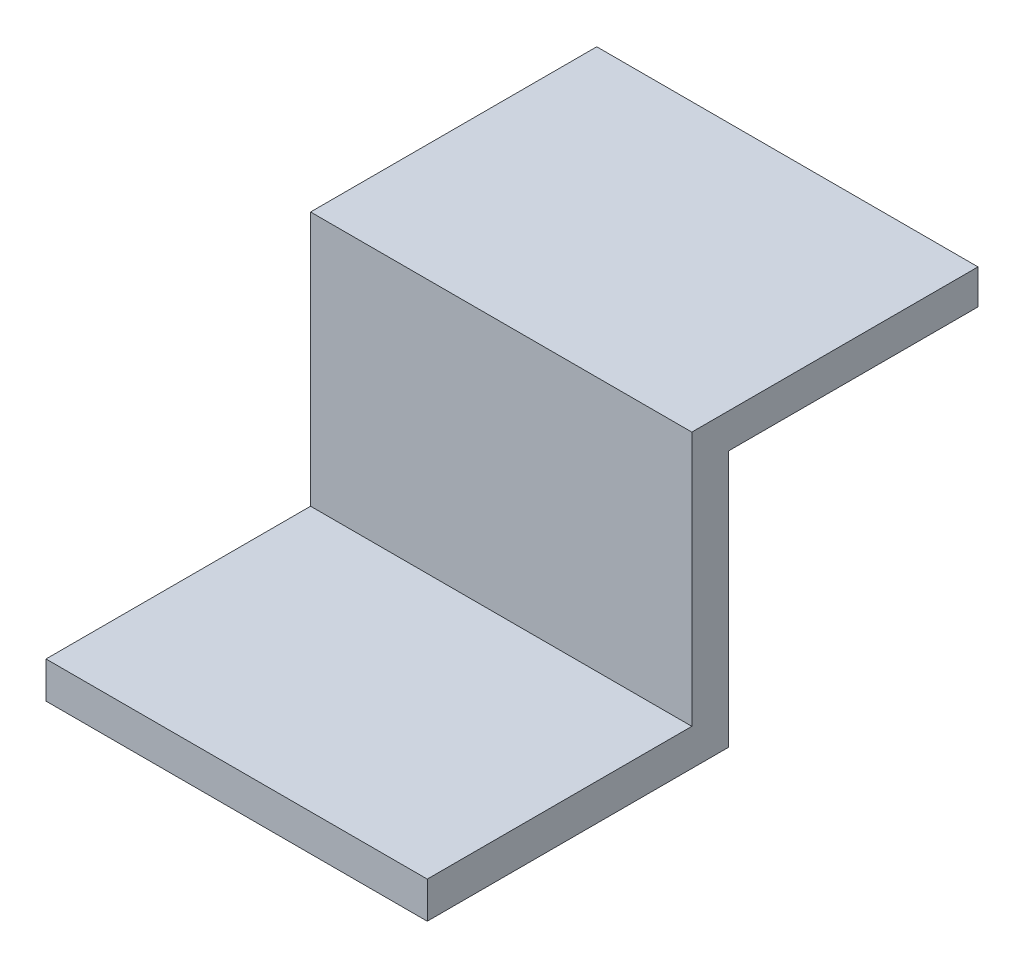
ISO-10303-21;
HEADER;
FILE_DESCRIPTION(('STEP AP214'),'2;1');
FILE_NAME('part.step','',(''),(''),'','','');
FILE_SCHEMA(('AUTOMOTIVE_DESIGN { 1 0 10303 214 1 1 1 1 }'));
ENDSEC;
DATA;
#1=APPLICATION_CONTEXT('core data for automotive mechanical design processes');
#2=APPLICATION_PROTOCOL_DEFINITION('international standard','automotive_design',2000,#1);
#3=PRODUCT_CONTEXT('',#1,'mechanical');
#4=PRODUCT('Part','Part','',(#3));
#5=PRODUCT_RELATED_PRODUCT_CATEGORY('part','',(#4));
#6=PRODUCT_DEFINITION_FORMATION('','',#4);
#7=PRODUCT_DEFINITION_CONTEXT('part definition',#1,'design');
#8=PRODUCT_DEFINITION('design','',#6,#7);
#9=PRODUCT_DEFINITION_SHAPE('','',#8);
#10=(LENGTH_UNIT() NAMED_UNIT(*) SI_UNIT(.MILLI.,.METRE.));
#11=(NAMED_UNIT(*) PLANE_ANGLE_UNIT() SI_UNIT($,.RADIAN.));
#12=(NAMED_UNIT(*) SI_UNIT($,.STERADIAN.) SOLID_ANGLE_UNIT());
#13=UNCERTAINTY_MEASURE_WITH_UNIT(LENGTH_MEASURE(1.E-05),#10,'distance_accuracy_value','');
#14=(GEOMETRIC_REPRESENTATION_CONTEXT(3) GLOBAL_UNCERTAINTY_ASSIGNED_CONTEXT((#13)) GLOBAL_UNIT_ASSIGNED_CONTEXT((#10,
#11,#12)) REPRESENTATION_CONTEXT('',''));
#15=CARTESIAN_POINT('',(0.,0.,0.));
#16=DIRECTION('',(0.,0.,1.));
#17=DIRECTION('',(1.,0.,0.));
#18=AXIS2_PLACEMENT_3D('',#15,#16,#17);
#19=CARTESIAN_POINT('',(-66.294,50.658753448874,-95.7628172012009));
#20=DIRECTION('',(0.,0.,-1.));
#21=DIRECTION('',(-1.,0.,0.));
#22=AXIS2_PLACEMENT_3D('',#19,#20,#21);
#23=PLANE('',#22);
#24=DIRECTION('',(0.,1.,0.));
#25=VECTOR('',#24,1.);
#26=CARTESIAN_POINT('',(0.,50.658753448874,-95.7628172012009));
#27=LINE('',#26,#25);
#28=CARTESIAN_POINT('',(0.,44.6271764040838,-95.7628172012009));
#29=VERTEX_POINT('',#28);
#30=CARTESIAN_POINT('',(0.,50.658753448874,-95.7628172012009));
#31=VERTEX_POINT('',#30);
#32=EDGE_CURVE('E142',#29,#31,#27,.T.);
#33=ORIENTED_EDGE('',*,*,#32,.F.);
#34=DIRECTION('',(1.,0.,0.));
#35=VECTOR('',#34,1.);
#36=CARTESIAN_POINT('',(-66.294,44.6271764040838,-95.7628172012009));
#37=LINE('',#36,#35);
#38=CARTESIAN_POINT('',(-66.294,44.6271764040838,-95.7628172012009));
#39=VERTEX_POINT('',#38);
#40=EDGE_CURVE('E41',#39,#29,#37,.T.);
#41=ORIENTED_EDGE('',*,*,#40,.F.);
#42=DIRECTION('',(0.,1.,0.));
#43=VECTOR('',#42,1.);
#44=CARTESIAN_POINT('',(-66.294,50.658753448874,-95.7628172012009));
#45=LINE('',#44,#43);
#46=CARTESIAN_POINT('',(-66.294,50.658753448874,-95.7628172012009));
#47=VERTEX_POINT('',#46);
#48=EDGE_CURVE('E116',#39,#47,#45,.T.);
#49=ORIENTED_EDGE('',*,*,#48,.T.);
#50=DIRECTION('',(1.,0.,0.));
#51=VECTOR('',#50,1.);
#52=CARTESIAN_POINT('',(-66.294,50.658753448874,-95.7628172012009));
#53=LINE('',#52,#51);
#54=EDGE_CURVE('E11',#47,#31,#53,.T.);
#55=ORIENTED_EDGE('',*,*,#54,.T.);
#56=EDGE_LOOP('',(#33,#41,#49,#55));
#57=FACE_BOUND('',#56,.T.);
#58=ADVANCED_FACE('F31',(#57),#23,.T.);
#59=CARTESIAN_POINT('',(-66.294,44.6271764040838,-52.3533001957925));
#60=DIRECTION('',(0.,-1.,0.));
#61=DIRECTION('',(0.,0.,-1.));
#62=AXIS2_PLACEMENT_3D('',#59,#60,#61);
#63=PLANE('',#62);
#64=DIRECTION('',(0.,0.,-1.));
#65=VECTOR('',#64,1.);
#66=CARTESIAN_POINT('',(0.,44.6271764040838,-52.3533001957925));
#67=LINE('',#66,#65);
#68=CARTESIAN_POINT('',(0.,44.6271764040838,-52.3533001957925));
#69=VERTEX_POINT('',#68);
#70=EDGE_CURVE('E102',#69,#29,#67,.T.);
#71=ORIENTED_EDGE('',*,*,#70,.F.);
#72=DIRECTION('',(1.,0.,0.));
#73=VECTOR('',#72,1.);
#74=CARTESIAN_POINT('',(-66.294,44.6271764040838,-52.3533001957925));
#75=LINE('',#74,#73);
#76=CARTESIAN_POINT('',(-66.294,44.6271764040838,-52.3533001957925));
#77=VERTEX_POINT('',#76);
#78=EDGE_CURVE('E97',#77,#69,#75,.T.);
#79=ORIENTED_EDGE('',*,*,#78,.F.);
#80=DIRECTION('',(0.,0.,-1.));
#81=VECTOR('',#80,1.);
#82=CARTESIAN_POINT('',(-66.294,44.6271764040838,-52.3533001957925));
#83=LINE('',#82,#81);
#84=EDGE_CURVE('E100',#77,#39,#83,.T.);
#85=ORIENTED_EDGE('',*,*,#84,.T.);
#86=ORIENTED_EDGE('',*,*,#40,.T.);
#87=EDGE_LOOP('',(#71,#79,#85,#86));
#88=FACE_BOUND('',#87,.T.);
#89=ADVANCED_FACE('F99',(#88),#63,.T.);
#90=CARTESIAN_POINT('',(-66.294,44.6271764040838,-52.3533001957925));
#91=DIRECTION('',(0.,0.,-1.));
#92=DIRECTION('',(0.,1.,0.));
#93=AXIS2_PLACEMENT_3D('',#90,#91,#92);
#94=PLANE('',#93);
#95=DIRECTION('',(0.,1.,0.));
#96=VECTOR('',#95,1.);
#97=CARTESIAN_POINT('',(0.,44.6271764040838,-52.3533001957925));
#98=LINE('',#97,#96);
#99=CARTESIAN_POINT('',(0.,0.,-52.3533001957925));
#100=VERTEX_POINT('',#99);
#101=EDGE_CURVE('E139',#100,#69,#98,.T.);
#102=ORIENTED_EDGE('',*,*,#101,.F.);
#103=DIRECTION('',(1.,0.,0.));
#104=VECTOR('',#103,1.);
#105=CARTESIAN_POINT('',(-66.294,0.,-52.3533001957925));
#106=LINE('',#105,#104);
#107=CARTESIAN_POINT('',(-66.294,0.,-52.3533001957925));
#108=VERTEX_POINT('',#107);
#109=EDGE_CURVE('E107',#108,#100,#106,.T.);
#110=ORIENTED_EDGE('',*,*,#109,.F.);
#111=DIRECTION('',(0.,1.,0.));
#112=VECTOR('',#111,1.);
#113=CARTESIAN_POINT('',(-66.294,44.6271764040838,-52.3533001957925));
#114=LINE('',#113,#112);
#115=EDGE_CURVE('E113',#108,#77,#114,.T.);
#116=ORIENTED_EDGE('',*,*,#115,.T.);
#117=ORIENTED_EDGE('',*,*,#78,.T.);
#118=EDGE_LOOP('',(#102,#110,#116,#117));
#119=FACE_BOUND('',#118,.T.);
#120=ADVANCED_FACE('F118',(#119),#94,.T.);
#121=CARTESIAN_POINT('',(-66.294,0.,-52.3533001957925));
#122=DIRECTION('',(0.,-1.,0.));
#123=DIRECTION('',(0.,0.,-1.));
#124=AXIS2_PLACEMENT_3D('',#121,#122,#123);
#125=PLANE('',#124);
#126=DIRECTION('',(0.,0.,-1.));
#127=VECTOR('',#126,1.);
#128=CARTESIAN_POINT('',(0.,0.,-52.3533001957925));
#129=LINE('',#128,#127);
#130=CARTESIAN_POINT('',(0.,0.,0.));
#131=VERTEX_POINT('',#130);
#132=EDGE_CURVE('E136',#131,#100,#129,.T.);
#133=ORIENTED_EDGE('',*,*,#132,.F.);
#134=DIRECTION('',(1.,0.,0.));
#135=VECTOR('',#134,1.);
#136=CARTESIAN_POINT('',(-66.294,0.,0.));
#137=LINE('',#136,#135);
#138=CARTESIAN_POINT('',(-66.294,0.,0.));
#139=VERTEX_POINT('',#138);
#140=EDGE_CURVE('E147',#139,#131,#137,.T.);
#141=ORIENTED_EDGE('',*,*,#140,.F.);
#142=DIRECTION('',(0.,0.,-1.));
#143=VECTOR('',#142,1.);
#144=CARTESIAN_POINT('',(-66.294,0.,-52.3533001957925));
#145=LINE('',#144,#143);
#146=EDGE_CURVE('E119',#139,#108,#145,.T.);
#147=ORIENTED_EDGE('',*,*,#146,.T.);
#148=ORIENTED_EDGE('',*,*,#109,.T.);
#149=EDGE_LOOP('',(#133,#141,#147,#148));
#150=FACE_BOUND('',#149,.T.);
#151=ADVANCED_FACE('F172',(#150),#125,.T.);
#152=CARTESIAN_POINT('',(-66.294,0.,0.));
#153=DIRECTION('',(0.,0.,1.));
#154=DIRECTION('',(1.,0.,0.));
#155=AXIS2_PLACEMENT_3D('',#152,#153,#154);
#156=PLANE('',#155);
#157=DIRECTION('',(0.,-1.,0.));
#158=VECTOR('',#157,1.);
#159=CARTESIAN_POINT('',(0.,0.,0.));
#160=LINE('',#159,#158);
#161=CARTESIAN_POINT('',(0.,6.35,0.));
#162=VERTEX_POINT('',#161);
#163=EDGE_CURVE('E133',#162,#131,#160,.T.);
#164=ORIENTED_EDGE('',*,*,#163,.F.);
#165=DIRECTION('',(1.,0.,0.));
#166=VECTOR('',#165,1.);
#167=CARTESIAN_POINT('',(-66.294,6.35,0.));
#168=LINE('',#167,#166);
#169=CARTESIAN_POINT('',(-66.294,6.35,0.));
#170=VERTEX_POINT('',#169);
#171=EDGE_CURVE('E149',#170,#162,#168,.T.);
#172=ORIENTED_EDGE('',*,*,#171,.F.);
#173=DIRECTION('',(0.,-1.,0.));
#174=VECTOR('',#173,1.);
#175=CARTESIAN_POINT('',(-66.294,0.,0.));
#176=LINE('',#175,#174);
#177=EDGE_CURVE('E121',#170,#139,#176,.T.);
#178=ORIENTED_EDGE('',*,*,#177,.T.);
#179=ORIENTED_EDGE('',*,*,#140,.T.);
#180=EDGE_LOOP('',(#164,#172,#178,#179));
#181=FACE_BOUND('',#180,.T.);
#182=ADVANCED_FACE('F175',(#181),#156,.T.);
#183=CARTESIAN_POINT('',(-66.294,6.35,0.));
#184=DIRECTION('',(0.,1.,0.));
#185=DIRECTION('',(0.,0.,1.));
#186=AXIS2_PLACEMENT_3D('',#183,#184,#185);
#187=PLANE('',#186);
#188=DIRECTION('',(0.,0.,1.));
#189=VECTOR('',#188,1.);
#190=CARTESIAN_POINT('',(0.,6.35,0.));
#191=LINE('',#190,#189);
#192=CARTESIAN_POINT('',(0.,6.35,-46.0033001957925));
#193=VERTEX_POINT('',#192);
#194=EDGE_CURVE('E130',#193,#162,#191,.T.);
#195=ORIENTED_EDGE('',*,*,#194,.F.);
#196=DIRECTION('',(1.,0.,0.));
#197=VECTOR('',#196,1.);
#198=CARTESIAN_POINT('',(-66.294,6.35,-46.0033001957925));
#199=LINE('',#198,#197);
#200=CARTESIAN_POINT('',(-66.294,6.35,-46.0033001957925));
#201=VERTEX_POINT('',#200);
#202=EDGE_CURVE('E150',#201,#193,#199,.T.);
#203=ORIENTED_EDGE('',*,*,#202,.F.);
#204=DIRECTION('',(0.,0.,1.));
#205=VECTOR('',#204,1.);
#206=CARTESIAN_POINT('',(-66.294,6.35,0.));
#207=LINE('',#206,#205);
#208=EDGE_CURVE('E254',#201,#170,#207,.T.);
#209=ORIENTED_EDGE('',*,*,#208,.T.);
#210=ORIENTED_EDGE('',*,*,#171,.T.);
#211=EDGE_LOOP('',(#195,#203,#209,#210));
#212=FACE_BOUND('',#211,.T.);
#213=ADVANCED_FACE('F179',(#212),#187,.T.);
#214=CARTESIAN_POINT('',(-66.294,6.35,-46.0033001957925));
#215=DIRECTION('',(0.,0.,1.));
#216=DIRECTION('',(1.,0.,0.));
#217=AXIS2_PLACEMENT_3D('',#214,#215,#216);
#218=PLANE('',#217);
#219=DIRECTION('',(0.,-1.,0.));
#220=VECTOR('',#219,1.);
#221=CARTESIAN_POINT('',(0.,6.35,-46.0033001957925));
#222=LINE('',#221,#220);
#223=CARTESIAN_POINT('',(0.,50.658753448874,-46.0033001957925));
#224=VERTEX_POINT('',#223);
#225=EDGE_CURVE('E127',#224,#193,#222,.T.);
#226=ORIENTED_EDGE('',*,*,#225,.F.);
#227=DIRECTION('',(1.,0.,0.));
#228=VECTOR('',#227,1.);
#229=CARTESIAN_POINT('',(-66.294,50.658753448874,-46.0033001957925));
#230=LINE('',#229,#228);
#231=CARTESIAN_POINT('',(-66.294,50.658753448874,-46.0033001957925));
#232=VERTEX_POINT('',#231);
#233=EDGE_CURVE('E35',#232,#224,#230,.T.);
#234=ORIENTED_EDGE('',*,*,#233,.F.);
#235=DIRECTION('',(0.,-1.,0.));
#236=VECTOR('',#235,1.);
#237=CARTESIAN_POINT('',(-66.294,6.35,-46.0033001957925));
#238=LINE('',#237,#236);
#239=EDGE_CURVE('E255',#232,#201,#238,.T.);
#240=ORIENTED_EDGE('',*,*,#239,.T.);
#241=ORIENTED_EDGE('',*,*,#202,.T.);
#242=EDGE_LOOP('',(#226,#234,#240,#241));
#243=FACE_BOUND('',#242,.T.);
#244=ADVANCED_FACE('F156',(#243),#218,.T.);
#245=CARTESIAN_POINT('',(-66.294,50.658753448874,-46.0033001957925));
#246=DIRECTION('',(0.,1.,0.));
#247=DIRECTION('',(0.,0.,1.));
#248=AXIS2_PLACEMENT_3D('',#245,#246,#247);
#249=PLANE('',#248);
#250=DIRECTION('',(0.,0.,1.));
#251=VECTOR('',#250,1.);
#252=CARTESIAN_POINT('',(0.,50.658753448874,-46.0033001957925));
#253=LINE('',#252,#251);
#254=EDGE_CURVE('E80',#31,#224,#253,.T.);
#255=ORIENTED_EDGE('',*,*,#254,.F.);
#256=ORIENTED_EDGE('',*,*,#54,.F.);
#257=DIRECTION('',(0.,0.,1.));
#258=VECTOR('',#257,1.);
#259=CARTESIAN_POINT('',(-66.294,50.658753448874,-52.3533001957925));
#260=LINE('',#259,#258);
#261=EDGE_CURVE('E83',#47,#232,#260,.T.);
#262=ORIENTED_EDGE('',*,*,#261,.T.);
#263=ORIENTED_EDGE('',*,*,#233,.T.);
#264=EDGE_LOOP('',(#255,#256,#262,#263));
#265=FACE_BOUND('',#264,.T.);
#266=ADVANCED_FACE('F33',(#265),#249,.T.);
#267=CARTESIAN_POINT('',(-66.294,50.658753448874,-95.7628172012009));
#268=DIRECTION('',(-1.,0.,0.));
#269=DIRECTION('',(0.,0.,1.));
#270=AXIS2_PLACEMENT_3D('',#267,#268,#269);
#271=PLANE('',#270);
#272=ORIENTED_EDGE('',*,*,#261,.F.);
#273=ORIENTED_EDGE('',*,*,#48,.F.);
#274=ORIENTED_EDGE('',*,*,#84,.F.);
#275=ORIENTED_EDGE('',*,*,#115,.F.);
#276=ORIENTED_EDGE('',*,*,#146,.F.);
#277=ORIENTED_EDGE('',*,*,#177,.F.);
#278=ORIENTED_EDGE('',*,*,#208,.F.);
#279=ORIENTED_EDGE('',*,*,#239,.F.);
#280=EDGE_LOOP('',(#272,#273,#274,#275,#276,#277,#278,#279));
#281=FACE_BOUND('',#280,.T.);
#282=ADVANCED_FACE('F111',(#281),#271,.T.);
#283=CARTESIAN_POINT('',(0.,50.658753448874,-95.7628172012009));
#284=DIRECTION('',(-1.,0.,0.));
#285=DIRECTION('',(0.,0.,1.));
#286=AXIS2_PLACEMENT_3D('',#283,#284,#285);
#287=PLANE('',#286);
#288=ORIENTED_EDGE('',*,*,#32,.T.);
#289=ORIENTED_EDGE('',*,*,#254,.T.);
#290=ORIENTED_EDGE('',*,*,#225,.T.);
#291=ORIENTED_EDGE('',*,*,#194,.T.);
#292=ORIENTED_EDGE('',*,*,#163,.T.);
#293=ORIENTED_EDGE('',*,*,#132,.T.);
#294=ORIENTED_EDGE('',*,*,#101,.T.);
#295=ORIENTED_EDGE('',*,*,#70,.T.);
#296=EDGE_LOOP('',(#288,#289,#290,#291,#292,#293,#294,#295));
#297=FACE_BOUND('',#296,.T.);
#298=ADVANCED_FACE('F158',(#297),#287,.F.);
#299=CLOSED_SHELL('',(#58,#89,#120,#151,#182,#213,#244,#266,#282,#298));
#300=MANIFOLD_SOLID_BREP('B2',#299);
#301=ADVANCED_BREP_SHAPE_REPRESENTATION('',(#18,#300),#14);
#302=SHAPE_DEFINITION_REPRESENTATION(#9,#301);
ENDSEC;
END-ISO-10303-21;
